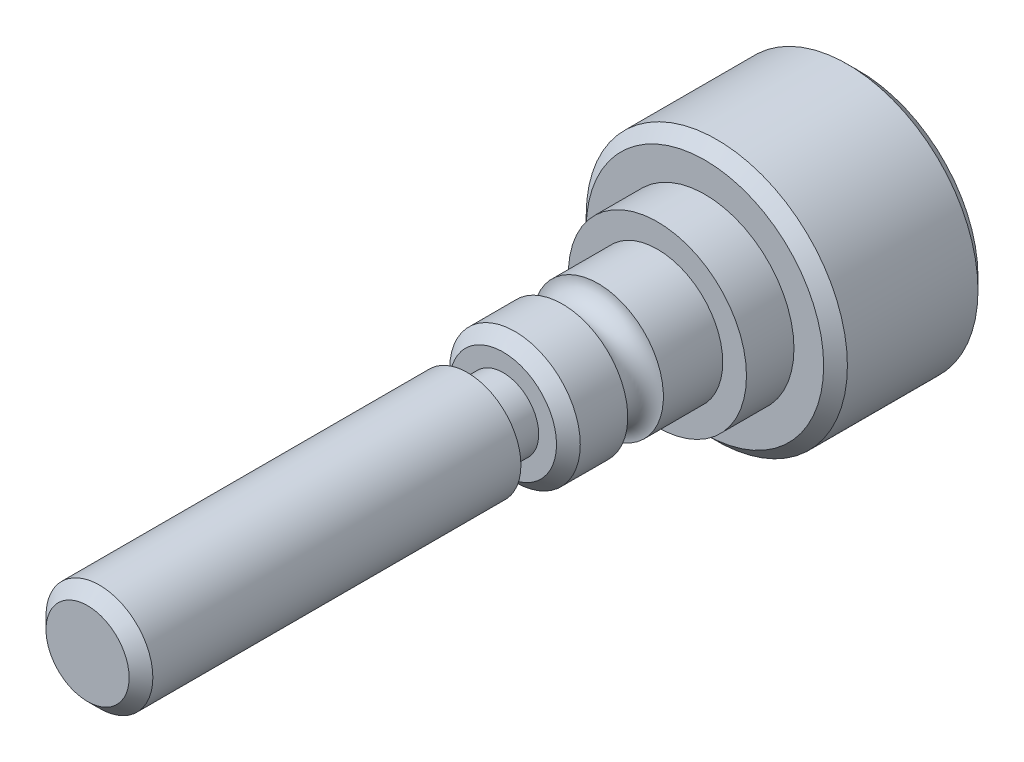
ISO-10303-21;
HEADER;
FILE_DESCRIPTION(('STEP AP214'),'2;1');
FILE_NAME('part.step','',(''),(''),'','','');
FILE_SCHEMA(('AUTOMOTIVE_DESIGN { 1 0 10303 214 1 1 1 1 }'));
ENDSEC;
DATA;
#1=APPLICATION_CONTEXT('core data for automotive mechanical design processes');
#2=APPLICATION_PROTOCOL_DEFINITION('international standard','automotive_design',2000,#1);
#3=PRODUCT_CONTEXT('',#1,'mechanical');
#4=PRODUCT('Part','Part','',(#3));
#5=PRODUCT_RELATED_PRODUCT_CATEGORY('part','',(#4));
#6=PRODUCT_DEFINITION_FORMATION('','',#4);
#7=PRODUCT_DEFINITION_CONTEXT('part definition',#1,'design');
#8=PRODUCT_DEFINITION('design','',#6,#7);
#9=PRODUCT_DEFINITION_SHAPE('','',#8);
#10=(LENGTH_UNIT() NAMED_UNIT(*) SI_UNIT(.MILLI.,.METRE.));
#11=(NAMED_UNIT(*) PLANE_ANGLE_UNIT() SI_UNIT($,.RADIAN.));
#12=(NAMED_UNIT(*) SI_UNIT($,.STERADIAN.) SOLID_ANGLE_UNIT());
#13=UNCERTAINTY_MEASURE_WITH_UNIT(LENGTH_MEASURE(1.E-05),#10,'distance_accuracy_value','');
#14=(GEOMETRIC_REPRESENTATION_CONTEXT(3) GLOBAL_UNCERTAINTY_ASSIGNED_CONTEXT((#13)) GLOBAL_UNIT_ASSIGNED_CONTEXT((#10,
#11,#12)) REPRESENTATION_CONTEXT('',''));
#15=CARTESIAN_POINT('',(0.,0.,0.));
#16=DIRECTION('',(0.,0.,1.));
#17=DIRECTION('',(1.,0.,0.));
#18=AXIS2_PLACEMENT_3D('',#15,#16,#17);
#19=CARTESIAN_POINT('',(0.,0.,30.));
#20=DIRECTION('',(0.,0.,-1.));
#21=DIRECTION('',(-1.,0.,0.));
#22=AXIS2_PLACEMENT_3D('',#19,#20,#21);
#23=CYLINDRICAL_SURFACE('',#22,5.5);
#24=CARTESIAN_POINT('',(0.,0.,29.));
#25=DIRECTION('',(0.,0.,1.));
#26=DIRECTION('',(1.,0.,0.));
#27=AXIS2_PLACEMENT_3D('',#24,#25,#26);
#28=CIRCLE('',#27,5.5);
#29=CARTESIAN_POINT('',(5.5,0.,29.));
#30=VERTEX_POINT('',#29);
#31=EDGE_CURVE('E113',#30,#30,#28,.F.);
#32=ORIENTED_EDGE('',*,*,#31,.T.);
#33=EDGE_LOOP('',(#32));
#34=FACE_BOUND('',#33,.T.);
#35=CARTESIAN_POINT('',(0.,0.,25.));
#36=DIRECTION('',(0.,0.,-1.));
#37=DIRECTION('',(-1.,0.,0.));
#38=AXIS2_PLACEMENT_3D('',#35,#36,#37);
#39=CIRCLE('',#38,5.5);
#40=CARTESIAN_POINT('',(-5.5,0.,25.));
#41=VERTEX_POINT('',#40);
#42=EDGE_CURVE('E11',#41,#41,#39,.T.);
#43=ORIENTED_EDGE('',*,*,#42,.F.);
#44=EDGE_LOOP('',(#43));
#45=FACE_BOUND('',#44,.T.);
#46=ADVANCED_FACE('F46',(#34,#45),#23,.T.);
#47=CARTESIAN_POINT('',(0.,0.,30.));
#48=DIRECTION('',(0.,0.,1.));
#49=DIRECTION('',(1.,0.,0.));
#50=AXIS2_PLACEMENT_3D('',#47,#48,#49);
#51=PLANE('',#50);
#52=CARTESIAN_POINT('',(0.,0.,30.));
#53=DIRECTION('',(0.,0.,1.));
#54=DIRECTION('',(1.,0.,0.));
#55=AXIS2_PLACEMENT_3D('',#52,#53,#54);
#56=CIRCLE('',#55,4.50000000000002);
#57=CARTESIAN_POINT('',(4.50000000000003,0.,30.));
#58=VERTEX_POINT('',#57);
#59=EDGE_CURVE('E109',#58,#58,#56,.T.);
#60=ORIENTED_EDGE('',*,*,#59,.T.);
#61=EDGE_LOOP('',(#60));
#62=FACE_BOUND('',#61,.T.);
#63=CARTESIAN_POINT('',(0.,0.,30.));
#64=DIRECTION('',(0.,0.,1.));
#65=DIRECTION('',(1.,0.,0.));
#66=AXIS2_PLACEMENT_3D('',#63,#64,#65);
#67=CIRCLE('',#66,3.);
#68=CARTESIAN_POINT('',(3.,0.,30.));
#69=VERTEX_POINT('',#68);
#70=EDGE_CURVE('E78',#69,#69,#67,.T.);
#71=ORIENTED_EDGE('',*,*,#70,.F.);
#72=EDGE_LOOP('',(#71));
#73=FACE_BOUND('',#72,.T.);
#74=ADVANCED_FACE('F153',(#62,#73),#51,.T.);
#75=CARTESIAN_POINT('',(0.,0.,33.));
#76=DIRECTION('',(0.,0.,-1.));
#77=DIRECTION('',(-1.,0.,0.));
#78=AXIS2_PLACEMENT_3D('',#75,#76,#77);
#79=CYLINDRICAL_SURFACE('',#78,3.);
#80=CARTESIAN_POINT('',(0.,0.,33.));
#81=DIRECTION('',(0.,0.,1.));
#82=DIRECTION('',(1.,0.,0.));
#83=AXIS2_PLACEMENT_3D('',#80,#81,#82);
#84=CIRCLE('',#83,3.);
#85=CARTESIAN_POINT('',(3.,0.,33.));
#86=VERTEX_POINT('',#85);
#87=EDGE_CURVE('E71',#86,#86,#84,.T.);
#88=ORIENTED_EDGE('',*,*,#87,.F.);
#89=EDGE_LOOP('',(#88));
#90=FACE_BOUND('',#89,.T.);
#91=ORIENTED_EDGE('',*,*,#70,.T.);
#92=EDGE_LOOP('',(#91));
#93=FACE_BOUND('',#92,.T.);
#94=ADVANCED_FACE('F159',(#90,#93),#79,.T.);
#95=CARTESIAN_POINT('',(0.,0.,65.));
#96=DIRECTION('',(0.,0.,-1.));
#97=DIRECTION('',(-1.,0.,0.));
#98=AXIS2_PLACEMENT_3D('',#95,#96,#97);
#99=CYLINDRICAL_SURFACE('',#98,4.5);
#100=CARTESIAN_POINT('',(0.,0.,64.));
#101=DIRECTION('',(0.,0.,1.));
#102=DIRECTION('',(1.,0.,0.));
#103=AXIS2_PLACEMENT_3D('',#100,#101,#102);
#104=CIRCLE('',#103,4.5);
#105=CARTESIAN_POINT('',(4.5,0.,64.));
#106=VERTEX_POINT('',#105);
#107=EDGE_CURVE('E105',#106,#106,#104,.F.);
#108=ORIENTED_EDGE('',*,*,#107,.T.);
#109=EDGE_LOOP('',(#108));
#110=FACE_BOUND('',#109,.T.);
#111=CARTESIAN_POINT('',(0.,0.,33.));
#112=DIRECTION('',(0.,0.,1.));
#113=DIRECTION('',(1.,0.,0.));
#114=AXIS2_PLACEMENT_3D('',#111,#112,#113);
#115=CIRCLE('',#114,4.5);
#116=CARTESIAN_POINT('',(4.5,0.,33.));
#117=VERTEX_POINT('',#116);
#118=EDGE_CURVE('E67',#117,#117,#115,.T.);
#119=ORIENTED_EDGE('',*,*,#118,.T.);
#120=EDGE_LOOP('',(#119));
#121=FACE_BOUND('',#120,.T.);
#122=ADVANCED_FACE('F279',(#110,#121),#99,.T.);
#123=CARTESIAN_POINT('',(0.,0.,65.));
#124=DIRECTION('',(0.,0.,1.));
#125=DIRECTION('',(1.,0.,0.));
#126=AXIS2_PLACEMENT_3D('',#123,#124,#125);
#127=PLANE('',#126);
#128=CARTESIAN_POINT('',(0.,0.,65.));
#129=DIRECTION('',(0.,0.,1.));
#130=DIRECTION('',(1.,0.,0.));
#131=AXIS2_PLACEMENT_3D('',#128,#129,#130);
#132=CIRCLE('',#131,3.5);
#133=CARTESIAN_POINT('',(3.5,0.,65.));
#134=VERTEX_POINT('',#133);
#135=EDGE_CURVE('E101',#134,#134,#132,.T.);
#136=ORIENTED_EDGE('',*,*,#135,.T.);
#137=EDGE_LOOP('',(#136));
#138=FACE_BOUND('',#137,.T.);
#139=ADVANCED_FACE('F268',(#138),#127,.T.);
#140=CARTESIAN_POINT('',(0.,0.,33.));
#141=DIRECTION('',(0.,0.,1.));
#142=DIRECTION('',(1.,0.,0.));
#143=AXIS2_PLACEMENT_3D('',#140,#141,#142);
#144=PLANE('',#143);
#145=ORIENTED_EDGE('',*,*,#87,.T.);
#146=EDGE_LOOP('',(#145));
#147=FACE_BOUND('',#146,.T.);
#148=ORIENTED_EDGE('',*,*,#118,.F.);
#149=EDGE_LOOP('',(#148));
#150=FACE_BOUND('',#149,.T.);
#151=ADVANCED_FACE('F258',(#147,#150),#144,.F.);
#152=CARTESIAN_POINT('',(0.,0.,65.));
#153=DIRECTION('',(0.,0.,-1.));
#154=DIRECTION('',(-1.,0.,0.));
#155=AXIS2_PLACEMENT_3D('',#152,#153,#154);
#156=CONICAL_SURFACE('',#155,3.5,0.785398163397443);
#157=ORIENTED_EDGE('',*,*,#107,.F.);
#158=EDGE_LOOP('',(#157));
#159=FACE_BOUND('',#158,.T.);
#160=ORIENTED_EDGE('',*,*,#135,.F.);
#161=EDGE_LOOP('',(#160));
#162=FACE_BOUND('',#161,.T.);
#163=ADVANCED_FACE('F249',(#159,#162),#156,.T.);
#164=CARTESIAN_POINT('',(0.,0.,30.));
#165=DIRECTION('',(0.,0.,-1.));
#166=DIRECTION('',(-1.,0.,0.));
#167=AXIS2_PLACEMENT_3D('',#164,#165,#166);
#168=CONICAL_SURFACE('',#167,4.50000000000002,0.78539816339745);
#169=ORIENTED_EDGE('',*,*,#31,.F.);
#170=EDGE_LOOP('',(#169));
#171=FACE_BOUND('',#170,.T.);
#172=ORIENTED_EDGE('',*,*,#59,.F.);
#173=EDGE_LOOP('',(#172));
#174=FACE_BOUND('',#173,.T.);
#175=ADVANCED_FACE('F239',(#171,#174),#168,.T.);
#176=CARTESIAN_POINT('',(0.,0.,23.5));
#177=DIRECTION('',(0.,0.,1.));
#178=DIRECTION('',(1.,0.,0.));
#179=AXIS2_PLACEMENT_3D('',#176,#177,#178);
#180=TOROIDAL_SURFACE('',#179,5.5,1.5);
#181=ORIENTED_EDGE('',*,*,#42,.T.);
#182=CARTESIAN_POINT('',(-5.5,0.,23.5));
#183=DIRECTION('',(0.,1.,0.));
#184=DIRECTION('',(0.,0.,1.));
#185=AXIS2_PLACEMENT_3D('',#182,#183,#184);
#186=CIRCLE('',#185,1.5);
#187=CARTESIAN_POINT('',(-5.5,0.,22.));
#188=VERTEX_POINT('',#187);
#189=EDGE_CURVE('E62',#41,#188,#186,.T.);
#190=ORIENTED_EDGE('',*,*,#189,.T.);
#191=CARTESIAN_POINT('',(0.,0.,22.));
#192=DIRECTION('',(0.,0.,1.));
#193=DIRECTION('',(1.,0.,0.));
#194=AXIS2_PLACEMENT_3D('',#191,#192,#193);
#195=CIRCLE('',#194,5.5);
#196=EDGE_CURVE('E56',#188,#188,#195,.T.);
#197=ORIENTED_EDGE('',*,*,#196,.T.);
#198=ORIENTED_EDGE('',*,*,#189,.F.);
#199=EDGE_LOOP('',(#181,#190,#197,#198));
#200=FACE_BOUND('',#199,.T.);
#201=ADVANCED_FACE('F63',(#200),#180,.F.);
#202=CARTESIAN_POINT('',(0.,0.,0.));
#203=DIRECTION('',(0.,0.,1.));
#204=DIRECTION('',(1.,0.,0.));
#205=AXIS2_PLACEMENT_3D('',#202,#203,#204);
#206=PLANE('',#205);
#207=CARTESIAN_POINT('',(0.,0.,0.));
#208=DIRECTION('',(0.,0.,1.));
#209=DIRECTION('',(1.,0.,0.));
#210=AXIS2_PLACEMENT_3D('',#207,#208,#209);
#211=CIRCLE('',#210,9.99999999999993);
#212=CARTESIAN_POINT('',(9.99999999999994,0.,0.));
#213=VERTEX_POINT('',#212);
#214=EDGE_CURVE('E97',#213,#213,#211,.F.);
#215=ORIENTED_EDGE('',*,*,#214,.T.);
#216=EDGE_LOOP('',(#215));
#217=FACE_BOUND('',#216,.T.);
#218=ADVANCED_FACE('F217',(#217),#206,.F.);
#219=CARTESIAN_POINT('',(0.,0.,1.00000000000006));
#220=DIRECTION('',(0.,0.,1.));
#221=DIRECTION('',(1.,0.,0.));
#222=AXIS2_PLACEMENT_3D('',#219,#220,#221);
#223=CONICAL_SURFACE('',#222,11.,0.78539816339745);
#224=ORIENTED_EDGE('',*,*,#214,.F.);
#225=EDGE_LOOP('',(#224));
#226=FACE_BOUND('',#225,.T.);
#227=CARTESIAN_POINT('',(0.,0.,1.00000000000006));
#228=DIRECTION('',(0.,0.,1.));
#229=DIRECTION('',(1.,0.,0.));
#230=AXIS2_PLACEMENT_3D('',#227,#228,#229);
#231=CIRCLE('',#230,11.);
#232=CARTESIAN_POINT('',(-11.,0.,1.00000000000007));
#233=VERTEX_POINT('',#232);
#234=EDGE_CURVE('E82',#233,#233,#231,.T.);
#235=ORIENTED_EDGE('',*,*,#234,.F.);
#236=EDGE_LOOP('',(#235));
#237=FACE_BOUND('',#236,.T.);
#238=ADVANCED_FACE('F207',(#226,#237),#223,.T.);
#239=CARTESIAN_POINT('',(0.,0.,13.));
#240=DIRECTION('',(0.,0.,-1.));
#241=DIRECTION('',(-1.,0.,0.));
#242=AXIS2_PLACEMENT_3D('',#239,#240,#241);
#243=CYLINDRICAL_SURFACE('',#242,11.);
#244=CARTESIAN_POINT('',(0.,0.,12.));
#245=DIRECTION('',(0.,0.,1.));
#246=DIRECTION('',(1.,0.,0.));
#247=AXIS2_PLACEMENT_3D('',#244,#245,#246);
#248=CIRCLE('',#247,11.);
#249=CARTESIAN_POINT('',(-11.,0.,12.));
#250=VERTEX_POINT('',#249);
#251=EDGE_CURVE('E121',#250,#250,#248,.F.);
#252=CARTESIAN_POINT('',(-11.,0.,12.));
#253=CARTESIAN_POINT('',(-11.,0.,11.8854166666667));
#254=CARTESIAN_POINT('',(-11.,0.,11.7708333333334));
#255=CARTESIAN_POINT('',(-11.,0.,11.5416666666667));
#256=CARTESIAN_POINT('',(-11.,0.,11.4270833333334));
#257=CARTESIAN_POINT('',(-11.,0.,11.1979166666667));
#258=CARTESIAN_POINT('',(-11.,0.,11.0833333333334));
#259=CARTESIAN_POINT('',(-11.,0.,10.8541666666667));
#260=CARTESIAN_POINT('',(-11.,0.,10.7395833333334));
#261=CARTESIAN_POINT('',(-11.,0.,10.5104166666667));
#262=CARTESIAN_POINT('',(-11.,0.,10.3958333333334));
#263=CARTESIAN_POINT('',(-11.,0.,10.1666666666667));
#264=CARTESIAN_POINT('',(-11.,0.,10.0520833333334));
#265=CARTESIAN_POINT('',(-11.,0.,9.82291666666671));
#266=CARTESIAN_POINT('',(-11.,0.,9.70833333333338));
#267=CARTESIAN_POINT('',(-11.,0.,9.47916666666671));
#268=CARTESIAN_POINT('',(-11.,0.,9.36458333333338));
#269=CARTESIAN_POINT('',(-11.,0.,9.13541666666671));
#270=CARTESIAN_POINT('',(-11.,0.,9.02083333333338));
#271=CARTESIAN_POINT('',(-11.,0.,8.79166666666671));
#272=CARTESIAN_POINT('',(-11.,0.,8.67708333333338));
#273=CARTESIAN_POINT('',(-11.,0.,8.44791666666671));
#274=CARTESIAN_POINT('',(-11.,0.,8.33333333333338));
#275=CARTESIAN_POINT('',(-11.,0.,8.10416666666671));
#276=CARTESIAN_POINT('',(-11.,0.,7.98958333333338));
#277=CARTESIAN_POINT('',(-11.,0.,7.76041666666672));
#278=CARTESIAN_POINT('',(-11.,0.,7.64583333333338));
#279=CARTESIAN_POINT('',(-11.,0.,7.41666666666672));
#280=CARTESIAN_POINT('',(-11.,0.,7.30208333333338));
#281=CARTESIAN_POINT('',(-11.,0.,7.07291666666672));
#282=CARTESIAN_POINT('',(-11.,0.,6.95833333333338));
#283=CARTESIAN_POINT('',(-11.,0.,6.72916666666672));
#284=CARTESIAN_POINT('',(-11.,0.,6.61458333333338));
#285=CARTESIAN_POINT('',(-11.,0.,6.38541666666672));
#286=CARTESIAN_POINT('',(-11.,0.,6.27083333333339));
#287=CARTESIAN_POINT('',(-11.,0.,6.04166666666672));
#288=CARTESIAN_POINT('',(-11.,0.,5.92708333333339));
#289=CARTESIAN_POINT('',(-11.,0.,5.69791666666672));
#290=CARTESIAN_POINT('',(-11.,0.,5.58333333333339));
#291=CARTESIAN_POINT('',(-11.,0.,5.35416666666672));
#292=CARTESIAN_POINT('',(-11.,0.,5.23958333333339));
#293=CARTESIAN_POINT('',(-11.,0.,5.01041666666672));
#294=CARTESIAN_POINT('',(-11.,0.,4.89583333333339));
#295=CARTESIAN_POINT('',(-11.,0.,4.66666666666672));
#296=CARTESIAN_POINT('',(-11.,0.,4.55208333333339));
#297=CARTESIAN_POINT('',(-11.,0.,4.32291666666672));
#298=CARTESIAN_POINT('',(-11.,0.,4.20833333333339));
#299=CARTESIAN_POINT('',(-11.,0.,3.97916666666672));
#300=CARTESIAN_POINT('',(-11.,0.,3.86458333333339));
#301=CARTESIAN_POINT('',(-11.,0.,3.63541666666673));
#302=CARTESIAN_POINT('',(-11.,0.,3.52083333333339));
#303=CARTESIAN_POINT('',(-11.,0.,3.29166666666673));
#304=CARTESIAN_POINT('',(-11.,0.,3.17708333333339));
#305=CARTESIAN_POINT('',(-11.,0.,2.94791666666673));
#306=CARTESIAN_POINT('',(-11.,0.,2.83333333333339));
#307=CARTESIAN_POINT('',(-11.,0.,2.60416666666673));
#308=CARTESIAN_POINT('',(-11.,0.,2.48958333333339));
#309=CARTESIAN_POINT('',(-11.,0.,2.26041666666673));
#310=CARTESIAN_POINT('',(-11.,0.,2.1458333333334));
#311=CARTESIAN_POINT('',(-11.,0.,1.91666666666673));
#312=CARTESIAN_POINT('',(-11.,0.,1.8020833333334));
#313=CARTESIAN_POINT('',(-11.,0.,1.57291666666673));
#314=CARTESIAN_POINT('',(-11.,0.,1.4583333333334));
#315=CARTESIAN_POINT('',(-11.,0.,1.22916666666673));
#316=CARTESIAN_POINT('',(-11.,0.,1.1145833333334));
#317=CARTESIAN_POINT('',(-11.,0.,1.00000000000007));
#318=B_SPLINE_CURVE_WITH_KNOTS('',3,(#252,#253,#254,#255,#256,#257,#258,#259,#260,#261,#262,
#263,#264,#265,#266,#267,#268,#269,#270,#271,#272,#273,#274,#275,#276,#277,#278,#279,#280,#281,
#282,#283,#284,#285,#286,#287,#288,#289,#290,#291,#292,#293,#294,#295,#296,#297,#298,#299,#300,
#301,#302,#303,#304,#305,#306,#307,#308,#309,#310,#311,#312,#313,#314,#315,#316,#317),
.UNSPECIFIED.,.F.,.F.,(4,2,2,2,2,2,2,2,2,2,2,2,2,2,2,2,2,2,2,2,2,2,2,2,2,2,2,2,2,2,2,2,4),(0.,
0.343749999999999,0.687499999999997,1.03125,1.375,1.71874999999999,2.06249999999999,
2.40624999999999,2.74999999999999,3.09374999999999,3.43749999999999,3.78124999999999,
4.12499999999999,4.46874999999999,4.81249999999999,5.15624999999999,5.49999999999998,
5.84374999999998,6.18749999999998,6.53124999999998,6.87499999999998,7.21874999999998,
7.56249999999998,7.90624999999998,8.24999999999998,8.59374999999998,8.93749999999998,
9.28124999999998,9.62499999999998,9.96874999999997,10.3125,10.65625,11.),.UNSPECIFIED.);
#319=EDGE_CURVE('BSEAM127',#250,#233,#318,.T.);
#320=ORIENTED_EDGE('',*,*,#251,.T.);
#321=ORIENTED_EDGE('',*,*,#234,.T.);
#322=ORIENTED_EDGE('',*,*,#319,.T.);
#323=ORIENTED_EDGE('',*,*,#319,.F.);
#324=EDGE_LOOP('',(#320,#322,#321,#323));
#325=FACE_BOUND('',#324,.T.);
#326=ADVANCED_FACE('F127',(#325),#243,.T.);
#327=CARTESIAN_POINT('',(0.,0.,13.));
#328=DIRECTION('',(0.,0.,-1.));
#329=DIRECTION('',(-1.,0.,0.));
#330=AXIS2_PLACEMENT_3D('',#327,#328,#329);
#331=CONICAL_SURFACE('',#330,10.,0.785398163397447);
#332=ORIENTED_EDGE('',*,*,#251,.F.);
#333=EDGE_LOOP('',(#332));
#334=FACE_BOUND('',#333,.T.);
#335=CARTESIAN_POINT('',(0.,0.,13.));
#336=DIRECTION('',(0.,0.,1.));
#337=DIRECTION('',(1.,0.,0.));
#338=AXIS2_PLACEMENT_3D('',#335,#336,#337);
#339=CIRCLE('',#338,10.);
#340=CARTESIAN_POINT('',(10.0000000000001,0.,13.));
#341=VERTEX_POINT('',#340);
#342=EDGE_CURVE('E117',#341,#341,#339,.T.);
#343=ORIENTED_EDGE('',*,*,#342,.F.);
#344=EDGE_LOOP('',(#343));
#345=FACE_BOUND('',#344,.T.);
#346=ADVANCED_FACE('F49',(#334,#345),#331,.T.);
#347=CARTESIAN_POINT('',(0.,0.,13.));
#348=DIRECTION('',(0.,0.,1.));
#349=DIRECTION('',(1.,0.,0.));
#350=AXIS2_PLACEMENT_3D('',#347,#348,#349);
#351=PLANE('',#350);
#352=ORIENTED_EDGE('',*,*,#342,.T.);
#353=EDGE_LOOP('',(#352));
#354=FACE_BOUND('',#353,.T.);
#355=CARTESIAN_POINT('',(0.,0.,13.));
#356=DIRECTION('',(0.,0.,1.));
#357=DIRECTION('',(1.,0.,0.));
#358=AXIS2_PLACEMENT_3D('',#355,#356,#357);
#359=CIRCLE('',#358,7.5);
#360=CARTESIAN_POINT('',(7.50000000000002,0.,13.));
#361=VERTEX_POINT('',#360);
#362=EDGE_CURVE('E87',#361,#361,#359,.T.);
#363=ORIENTED_EDGE('',*,*,#362,.F.);
#364=EDGE_LOOP('',(#363));
#365=FACE_BOUND('',#364,.T.);
#366=ADVANCED_FACE('F132',(#354,#365),#351,.T.);
#367=CARTESIAN_POINT('',(0.,0.,17.));
#368=DIRECTION('',(0.,0.,-1.));
#369=DIRECTION('',(-1.,0.,0.));
#370=AXIS2_PLACEMENT_3D('',#367,#368,#369);
#371=CYLINDRICAL_SURFACE('',#370,7.5);
#372=CARTESIAN_POINT('',(0.,0.,17.));
#373=DIRECTION('',(0.,0.,1.));
#374=DIRECTION('',(1.,0.,0.));
#375=AXIS2_PLACEMENT_3D('',#372,#373,#374);
#376=CIRCLE('',#375,7.5);
#377=CARTESIAN_POINT('',(7.50000000000002,0.,17.));
#378=VERTEX_POINT('',#377);
#379=EDGE_CURVE('E77',#378,#378,#376,.T.);
#380=ORIENTED_EDGE('',*,*,#379,.F.);
#381=EDGE_LOOP('',(#380));
#382=FACE_BOUND('',#381,.T.);
#383=ORIENTED_EDGE('',*,*,#362,.T.);
#384=EDGE_LOOP('',(#383));
#385=FACE_BOUND('',#384,.T.);
#386=ADVANCED_FACE('F137',(#382,#385),#371,.T.);
#387=CARTESIAN_POINT('',(0.,0.,17.));
#388=DIRECTION('',(0.,0.,1.));
#389=DIRECTION('',(1.,0.,0.));
#390=AXIS2_PLACEMENT_3D('',#387,#388,#389);
#391=PLANE('',#390);
#392=CARTESIAN_POINT('',(0.,0.,17.));
#393=DIRECTION('',(0.,0.,1.));
#394=DIRECTION('',(1.,0.,0.));
#395=AXIS2_PLACEMENT_3D('',#392,#393,#394);
#396=CIRCLE('',#395,5.5);
#397=CARTESIAN_POINT('',(5.50000000000001,0.,17.));
#398=VERTEX_POINT('',#397);
#399=EDGE_CURVE('E83',#398,#398,#396,.T.);
#400=ORIENTED_EDGE('',*,*,#399,.F.);
#401=EDGE_LOOP('',(#400));
#402=FACE_BOUND('',#401,.T.);
#403=ORIENTED_EDGE('',*,*,#379,.T.);
#404=EDGE_LOOP('',(#403));
#405=FACE_BOUND('',#404,.T.);
#406=ADVANCED_FACE('F142',(#402,#405),#391,.T.);
#407=ORIENTED_EDGE('',*,*,#399,.T.);
#408=EDGE_LOOP('',(#407));
#409=FACE_BOUND('',#408,.T.);
#410=ORIENTED_EDGE('',*,*,#196,.F.);
#411=EDGE_LOOP('',(#410));
#412=FACE_BOUND('',#411,.T.);
#413=ADVANCED_FACE('F148',(#409,#412),#23,.T.);
#414=CLOSED_SHELL('',(#46,#74,#94,#122,#139,#151,#163,#175,#201,#218,#238,#326,#346,#366,#386,
#406,#413));
#415=MANIFOLD_SOLID_BREP('B2',#414);
#416=ADVANCED_BREP_SHAPE_REPRESENTATION('',(#18,#415),#14);
#417=SHAPE_DEFINITION_REPRESENTATION(#9,#416);
ENDSEC;
END-ISO-10303-21;
